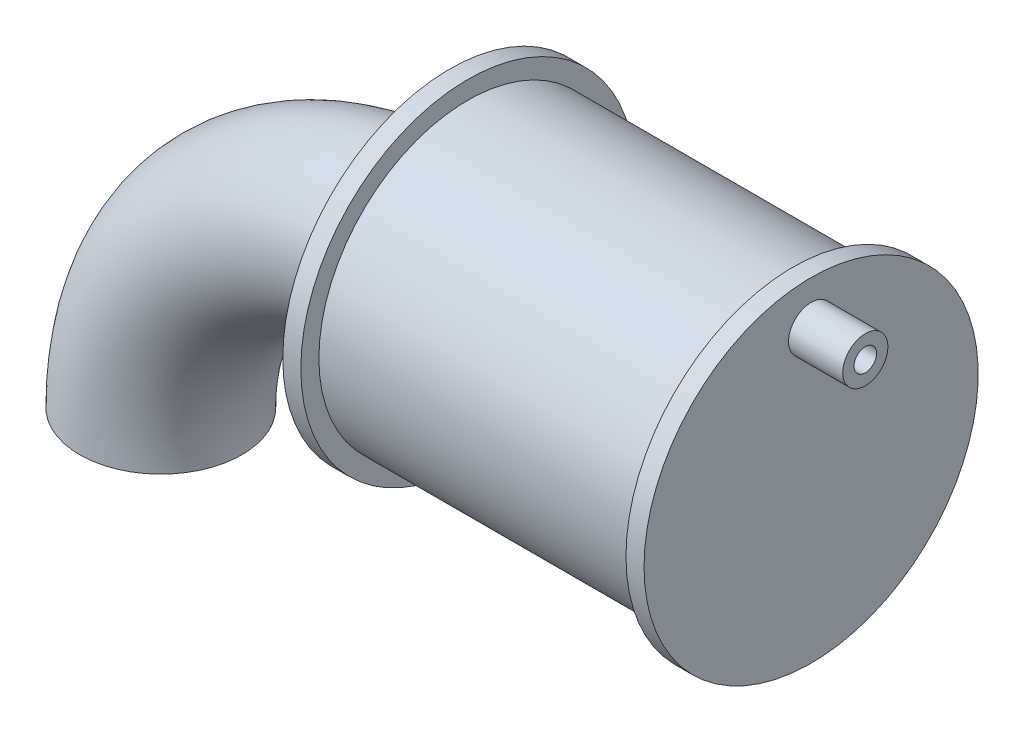
ISO-10303-21;
HEADER;
FILE_DESCRIPTION(('STEP AP214'),'2;1');
FILE_NAME('part.step','',(''),(''),'','','');
FILE_SCHEMA(('AUTOMOTIVE_DESIGN { 1 0 10303 214 1 1 1 1 }'));
ENDSEC;
DATA;
#1=APPLICATION_CONTEXT('core data for automotive mechanical design processes');
#2=APPLICATION_PROTOCOL_DEFINITION('international standard','automotive_design',2000,#1);
#3=PRODUCT_CONTEXT('',#1,'mechanical');
#4=PRODUCT('Part','Part','',(#3));
#5=PRODUCT_RELATED_PRODUCT_CATEGORY('part','',(#4));
#6=PRODUCT_DEFINITION_FORMATION('','',#4);
#7=PRODUCT_DEFINITION_CONTEXT('part definition',#1,'design');
#8=PRODUCT_DEFINITION('design','',#6,#7);
#9=PRODUCT_DEFINITION_SHAPE('','',#8);
#10=(LENGTH_UNIT() NAMED_UNIT(*) SI_UNIT(.MILLI.,.METRE.));
#11=(NAMED_UNIT(*) PLANE_ANGLE_UNIT() SI_UNIT($,.RADIAN.));
#12=(NAMED_UNIT(*) SI_UNIT($,.STERADIAN.) SOLID_ANGLE_UNIT());
#13=UNCERTAINTY_MEASURE_WITH_UNIT(LENGTH_MEASURE(1.E-05),#10,'distance_accuracy_value','');
#14=(GEOMETRIC_REPRESENTATION_CONTEXT(3) GLOBAL_UNCERTAINTY_ASSIGNED_CONTEXT((#13)) GLOBAL_UNIT_ASSIGNED_CONTEXT((#10,
#11,#12)) REPRESENTATION_CONTEXT('',''));
#15=CARTESIAN_POINT('',(0.,0.,0.));
#16=DIRECTION('',(0.,0.,1.));
#17=DIRECTION('',(1.,0.,0.));
#18=AXIS2_PLACEMENT_3D('',#15,#16,#17);
#19=CARTESIAN_POINT('',(38.,15.5,0.));
#20=DIRECTION('',(1.,0.,0.));
#21=DIRECTION('',(0.,0.,-1.));
#22=AXIS2_PLACEMENT_3D('',#19,#20,#21);
#23=PLANE('',#22);
#24=CARTESIAN_POINT('',(38.,13.611815839676,0.));
#25=DIRECTION('',(1.,0.,0.));
#26=DIRECTION('',(0.,0.,-1.));
#27=AXIS2_PLACEMENT_3D('',#24,#25,#26);
#28=CIRCLE('',#27,1.25);
#29=CARTESIAN_POINT('',(38.,13.611815839676,-1.25));
#30=VERTEX_POINT('',#29);
#31=EDGE_CURVE('E36',#30,#30,#28,.T.);
#32=ORIENTED_EDGE('',*,*,#31,.T.);
#33=EDGE_LOOP('',(#32));
#34=FACE_BOUND('',#33,.T.);
#35=CARTESIAN_POINT('',(38.,0.,0.));
#36=DIRECTION('',(-1.,0.,0.));
#37=DIRECTION('',(0.,0.,1.));
#38=AXIS2_PLACEMENT_3D('',#35,#36,#37);
#39=CIRCLE('',#38,15.5);
#40=CARTESIAN_POINT('',(38.,0.,15.5));
#41=VERTEX_POINT('',#40);
#42=EDGE_CURVE('E61',#41,#41,#39,.T.);
#43=ORIENTED_EDGE('',*,*,#42,.T.);
#44=EDGE_LOOP('',(#43));
#45=FACE_BOUND('',#44,.T.);
#46=ADVANCED_FACE('F32',(#34,#45),#23,.F.);
#47=CARTESIAN_POINT('',(-25.0815446339017,0.,0.));
#48=DIRECTION('',(-1.,0.,0.));
#49=DIRECTION('',(0.,0.,1.));
#50=AXIS2_PLACEMENT_3D('',#47,#48,#49);
#51=CYLINDRICAL_SURFACE('',#50,15.5);
#52=ORIENTED_EDGE('',*,*,#42,.F.);
#53=EDGE_LOOP('',(#52));
#54=FACE_BOUND('',#53,.T.);
#55=CARTESIAN_POINT('',(2.,0.,0.));
#56=DIRECTION('',(-1.,0.,0.));
#57=DIRECTION('',(0.,0.,1.));
#58=AXIS2_PLACEMENT_3D('',#55,#56,#57);
#59=CIRCLE('',#58,15.5);
#60=CARTESIAN_POINT('',(2.,0.,15.5));
#61=VERTEX_POINT('',#60);
#62=EDGE_CURVE('E64',#61,#61,#59,.T.);
#63=ORIENTED_EDGE('',*,*,#62,.T.);
#64=EDGE_LOOP('',(#63));
#65=FACE_BOUND('',#64,.T.);
#66=ADVANCED_FACE('F97',(#54,#65),#51,.F.);
#67=CARTESIAN_POINT('',(2.,15.5,0.));
#68=DIRECTION('',(-1.,0.,0.));
#69=DIRECTION('',(0.,0.,1.));
#70=AXIS2_PLACEMENT_3D('',#67,#68,#69);
#71=PLANE('',#70);
#72=ORIENTED_EDGE('',*,*,#62,.F.);
#73=EDGE_LOOP('',(#72));
#74=FACE_BOUND('',#73,.T.);
#75=CARTESIAN_POINT('',(2.,0.,0.));
#76=DIRECTION('',(1.,0.,0.));
#77=DIRECTION('',(0.,0.,-1.));
#78=AXIS2_PLACEMENT_3D('',#75,#76,#77);
#79=CIRCLE('',#78,7.);
#80=CARTESIAN_POINT('',(2.,0.,-7.));
#81=VERTEX_POINT('',#80);
#82=EDGE_CURVE('E88',#81,#81,#79,.T.);
#83=ORIENTED_EDGE('',*,*,#82,.F.);
#84=EDGE_LOOP('',(#83));
#85=FACE_BOUND('',#84,.T.);
#86=ADVANCED_FACE('F94',(#74,#85),#71,.F.);
#87=CARTESIAN_POINT('',(31.7,13.611815839676,0.));
#88=DIRECTION('',(1.,0.,0.));
#89=DIRECTION('',(0.,0.,-1.));
#90=AXIS2_PLACEMENT_3D('',#87,#88,#89);
#91=CYLINDRICAL_SURFACE('',#90,1.25);
#92=CARTESIAN_POINT('',(46.,13.611815839676,0.));
#93=DIRECTION('',(1.,0.,0.));
#94=DIRECTION('',(0.,0.,-1.));
#95=AXIS2_PLACEMENT_3D('',#92,#93,#94);
#96=CIRCLE('',#95,1.25);
#97=CARTESIAN_POINT('',(46.,13.611815839676,-1.25));
#98=VERTEX_POINT('',#97);
#99=EDGE_CURVE('E70',#98,#98,#96,.T.);
#100=CARTESIAN_POINT('',(46.,13.611815839676,-1.25));
#101=CARTESIAN_POINT('',(45.9166666666667,13.611815839676,-1.25));
#102=CARTESIAN_POINT('',(45.8333333333333,13.611815839676,-1.25));
#103=CARTESIAN_POINT('',(45.6666666666667,13.611815839676,-1.25));
#104=CARTESIAN_POINT('',(45.5833333333333,13.611815839676,-1.25));
#105=CARTESIAN_POINT('',(45.4166666666667,13.611815839676,-1.25));
#106=CARTESIAN_POINT('',(45.3333333333333,13.611815839676,-1.25));
#107=CARTESIAN_POINT('',(45.1666666666667,13.611815839676,-1.25));
#108=CARTESIAN_POINT('',(45.0833333333333,13.611815839676,-1.25));
#109=CARTESIAN_POINT('',(44.9166666666667,13.611815839676,-1.25));
#110=CARTESIAN_POINT('',(44.8333333333333,13.611815839676,-1.25));
#111=CARTESIAN_POINT('',(44.6666666666667,13.611815839676,-1.25));
#112=CARTESIAN_POINT('',(44.5833333333333,13.611815839676,-1.25));
#113=CARTESIAN_POINT('',(44.4166666666667,13.611815839676,-1.25));
#114=CARTESIAN_POINT('',(44.3333333333333,13.611815839676,-1.25));
#115=CARTESIAN_POINT('',(44.1666666666667,13.611815839676,-1.25));
#116=CARTESIAN_POINT('',(44.0833333333333,13.611815839676,-1.25));
#117=CARTESIAN_POINT('',(43.9166666666667,13.611815839676,-1.25));
#118=CARTESIAN_POINT('',(43.8333333333333,13.611815839676,-1.25));
#119=CARTESIAN_POINT('',(43.6666666666667,13.611815839676,-1.25));
#120=CARTESIAN_POINT('',(43.5833333333333,13.611815839676,-1.25));
#121=CARTESIAN_POINT('',(43.4166666666667,13.611815839676,-1.25));
#122=CARTESIAN_POINT('',(43.3333333333333,13.611815839676,-1.25));
#123=CARTESIAN_POINT('',(43.1666666666667,13.611815839676,-1.25));
#124=CARTESIAN_POINT('',(43.0833333333333,13.611815839676,-1.25));
#125=CARTESIAN_POINT('',(42.9166666666667,13.611815839676,-1.25));
#126=CARTESIAN_POINT('',(42.8333333333333,13.611815839676,-1.25));
#127=CARTESIAN_POINT('',(42.6666666666667,13.611815839676,-1.25));
#128=CARTESIAN_POINT('',(42.5833333333333,13.611815839676,-1.25));
#129=CARTESIAN_POINT('',(42.4166666666667,13.611815839676,-1.25));
#130=CARTESIAN_POINT('',(42.3333333333333,13.611815839676,-1.25));
#131=CARTESIAN_POINT('',(42.1666666666667,13.611815839676,-1.25));
#132=CARTESIAN_POINT('',(42.0833333333333,13.611815839676,-1.25));
#133=CARTESIAN_POINT('',(41.9166666666667,13.611815839676,-1.25));
#134=CARTESIAN_POINT('',(41.8333333333333,13.611815839676,-1.25));
#135=CARTESIAN_POINT('',(41.6666666666667,13.611815839676,-1.25));
#136=CARTESIAN_POINT('',(41.5833333333333,13.611815839676,-1.25));
#137=CARTESIAN_POINT('',(41.4166666666667,13.611815839676,-1.25));
#138=CARTESIAN_POINT('',(41.3333333333333,13.611815839676,-1.25));
#139=CARTESIAN_POINT('',(41.1666666666667,13.611815839676,-1.25));
#140=CARTESIAN_POINT('',(41.0833333333333,13.611815839676,-1.25));
#141=CARTESIAN_POINT('',(40.9166666666667,13.611815839676,-1.25));
#142=CARTESIAN_POINT('',(40.8333333333333,13.611815839676,-1.25));
#143=CARTESIAN_POINT('',(40.6666666666667,13.611815839676,-1.25));
#144=CARTESIAN_POINT('',(40.5833333333333,13.611815839676,-1.25));
#145=CARTESIAN_POINT('',(40.4166666666667,13.611815839676,-1.25));
#146=CARTESIAN_POINT('',(40.3333333333333,13.611815839676,-1.25));
#147=CARTESIAN_POINT('',(40.1666666666667,13.611815839676,-1.25));
#148=CARTESIAN_POINT('',(40.0833333333333,13.611815839676,-1.25));
#149=CARTESIAN_POINT('',(39.9166666666667,13.611815839676,-1.25));
#150=CARTESIAN_POINT('',(39.8333333333333,13.611815839676,-1.25));
#151=CARTESIAN_POINT('',(39.6666666666667,13.611815839676,-1.25));
#152=CARTESIAN_POINT('',(39.5833333333333,13.611815839676,-1.25));
#153=CARTESIAN_POINT('',(39.4166666666667,13.611815839676,-1.25));
#154=CARTESIAN_POINT('',(39.3333333333333,13.611815839676,-1.25));
#155=CARTESIAN_POINT('',(39.1666666666667,13.611815839676,-1.25));
#156=CARTESIAN_POINT('',(39.0833333333333,13.611815839676,-1.25));
#157=CARTESIAN_POINT('',(38.9166666666667,13.611815839676,-1.25));
#158=CARTESIAN_POINT('',(38.8333333333333,13.611815839676,-1.25));
#159=CARTESIAN_POINT('',(38.6666666666667,13.611815839676,-1.25));
#160=CARTESIAN_POINT('',(38.5833333333333,13.611815839676,-1.25));
#161=CARTESIAN_POINT('',(38.4166666666667,13.611815839676,-1.25));
#162=CARTESIAN_POINT('',(38.3333333333333,13.611815839676,-1.25));
#163=CARTESIAN_POINT('',(38.1666666666667,13.611815839676,-1.25));
#164=CARTESIAN_POINT('',(38.0833333333333,13.611815839676,-1.25));
#165=CARTESIAN_POINT('',(38.,13.611815839676,-1.25));
#166=B_SPLINE_CURVE_WITH_KNOTS('',3,(#100,#101,#102,#103,#104,#105,#106,#107,#108,#109,#110,
#111,#112,#113,#114,#115,#116,#117,#118,#119,#120,#121,#122,#123,#124,#125,#126,#127,#128,#129,
#130,#131,#132,#133,#134,#135,#136,#137,#138,#139,#140,#141,#142,#143,#144,#145,#146,#147,#148,
#149,#150,#151,#152,#153,#154,#155,#156,#157,#158,#159,#160,#161,#162,#163,#164,#165),
.UNSPECIFIED.,.F.,.F.,(4,2,2,2,2,2,2,2,2,2,2,2,2,2,2,2,2,2,2,2,2,2,2,2,2,2,2,2,2,2,2,2,4),(0.,
0.25,0.5,0.750000000000001,1.,1.25,1.5,1.75,2.,2.25,2.5,2.75,3.,3.25,3.5,3.75,4.,4.25,4.5,4.75,
5.,5.25,5.5,5.75,5.99999999999999,6.24999999999999,6.49999999999999,6.74999999999999,
6.99999999999999,7.24999999999999,7.49999999999999,7.74999999999999,7.99999999999999),.UNSPECIFIED.);
#167=EDGE_CURVE('BSEAM96',#98,#30,#166,.T.);
#168=ORIENTED_EDGE('',*,*,#99,.T.);
#169=ORIENTED_EDGE('',*,*,#31,.F.);
#170=ORIENTED_EDGE('',*,*,#167,.T.);
#171=ORIENTED_EDGE('',*,*,#167,.F.);
#172=EDGE_LOOP('',(#168,#170,#169,#171));
#173=FACE_BOUND('',#172,.T.);
#174=ADVANCED_FACE('F96',(#173),#91,.F.);
#175=CARTESIAN_POINT('',(40.,0.,0.));
#176=DIRECTION('',(-1.,0.,0.));
#177=DIRECTION('',(0.,0.,1.));
#178=AXIS2_PLACEMENT_3D('',#175,#176,#177);
#179=PLANE('',#178);
#180=CARTESIAN_POINT('',(40.,0.,0.));
#181=DIRECTION('',(-1.,0.,0.));
#182=DIRECTION('',(0.,0.,1.));
#183=AXIS2_PLACEMENT_3D('',#180,#181,#182);
#184=CIRCLE('',#183,18.5);
#185=CARTESIAN_POINT('',(40.,0.,18.5));
#186=VERTEX_POINT('',#185);
#187=EDGE_CURVE('E58',#186,#186,#184,.T.);
#188=ORIENTED_EDGE('',*,*,#187,.F.);
#189=EDGE_LOOP('',(#188));
#190=FACE_BOUND('',#189,.T.);
#191=CARTESIAN_POINT('',(40.,13.611815839676,0.));
#192=DIRECTION('',(-1.,0.,0.));
#193=DIRECTION('',(0.,0.,1.));
#194=AXIS2_PLACEMENT_3D('',#191,#192,#193);
#195=CIRCLE('',#194,2.5);
#196=CARTESIAN_POINT('',(40.,13.611815839676,2.5));
#197=VERTEX_POINT('',#196);
#198=EDGE_CURVE('E10',#197,#197,#195,.F.);
#199=ORIENTED_EDGE('',*,*,#198,.F.);
#200=EDGE_LOOP('',(#199));
#201=FACE_BOUND('',#200,.T.);
#202=ADVANCED_FACE('F104',(#190,#201),#179,.F.);
#203=CARTESIAN_POINT('',(0.,0.,0.));
#204=DIRECTION('',(1.,0.,0.));
#205=DIRECTION('',(0.,0.,-1.));
#206=AXIS2_PLACEMENT_3D('',#203,#204,#205);
#207=PLANE('',#206);
#208=CARTESIAN_POINT('',(0.,0.,0.));
#209=DIRECTION('',(-1.,0.,0.));
#210=DIRECTION('',(0.,0.,1.));
#211=AXIS2_PLACEMENT_3D('',#208,#209,#210);
#212=CIRCLE('',#211,9.);
#213=CARTESIAN_POINT('',(0.,0.,9.));
#214=VERTEX_POINT('',#213);
#215=EDGE_CURVE('E73',#214,#214,#212,.T.);
#216=ORIENTED_EDGE('',*,*,#215,.F.);
#217=EDGE_LOOP('',(#216));
#218=FACE_BOUND('',#217,.T.);
#219=CARTESIAN_POINT('',(0.,0.,0.));
#220=DIRECTION('',(-1.,0.,0.));
#221=DIRECTION('',(0.,0.,1.));
#222=AXIS2_PLACEMENT_3D('',#219,#220,#221);
#223=CIRCLE('',#222,18.5);
#224=CARTESIAN_POINT('',(0.,0.,18.5));
#225=VERTEX_POINT('',#224);
#226=EDGE_CURVE('E40',#225,#225,#223,.T.);
#227=ORIENTED_EDGE('',*,*,#226,.T.);
#228=EDGE_LOOP('',(#227));
#229=FACE_BOUND('',#228,.T.);
#230=ADVANCED_FACE('F34',(#218,#229),#207,.F.);
#231=CARTESIAN_POINT('',(-25.0815446339017,0.,0.));
#232=DIRECTION('',(-1.,0.,0.));
#233=DIRECTION('',(0.,0.,1.));
#234=AXIS2_PLACEMENT_3D('',#231,#232,#233);
#235=CYLINDRICAL_SURFACE('',#234,18.5);
#236=ORIENTED_EDGE('',*,*,#226,.F.);
#237=EDGE_LOOP('',(#236));
#238=FACE_BOUND('',#237,.T.);
#239=CARTESIAN_POINT('',(2.00000000000001,0.,0.));
#240=DIRECTION('',(-1.,0.,0.));
#241=DIRECTION('',(0.,0.,1.));
#242=AXIS2_PLACEMENT_3D('',#239,#240,#241);
#243=CIRCLE('',#242,18.5);
#244=CARTESIAN_POINT('',(2.00000000000001,0.,18.5));
#245=VERTEX_POINT('',#244);
#246=EDGE_CURVE('E44',#245,#245,#243,.T.);
#247=ORIENTED_EDGE('',*,*,#246,.T.);
#248=EDGE_LOOP('',(#247));
#249=FACE_BOUND('',#248,.T.);
#250=ADVANCED_FACE('F137',(#238,#249),#235,.T.);
#251=CARTESIAN_POINT('',(2.00000000000001,16.5,0.));
#252=DIRECTION('',(-1.,0.,0.));
#253=DIRECTION('',(0.,0.,1.));
#254=AXIS2_PLACEMENT_3D('',#251,#252,#253);
#255=PLANE('',#254);
#256=ORIENTED_EDGE('',*,*,#246,.F.);
#257=EDGE_LOOP('',(#256));
#258=FACE_BOUND('',#257,.T.);
#259=CARTESIAN_POINT('',(2.00000000000001,0.,0.));
#260=DIRECTION('',(-1.,0.,0.));
#261=DIRECTION('',(0.,0.,1.));
#262=AXIS2_PLACEMENT_3D('',#259,#260,#261);
#263=CIRCLE('',#262,16.5);
#264=CARTESIAN_POINT('',(2.00000000000001,0.,16.5));
#265=VERTEX_POINT('',#264);
#266=EDGE_CURVE('E49',#265,#265,#263,.T.);
#267=ORIENTED_EDGE('',*,*,#266,.T.);
#268=EDGE_LOOP('',(#267));
#269=FACE_BOUND('',#268,.T.);
#270=ADVANCED_FACE('F134',(#258,#269),#255,.F.);
#271=CARTESIAN_POINT('',(-25.0815446339017,0.,0.));
#272=DIRECTION('',(-1.,0.,0.));
#273=DIRECTION('',(0.,0.,1.));
#274=AXIS2_PLACEMENT_3D('',#271,#272,#273);
#275=CYLINDRICAL_SURFACE('',#274,16.5);
#276=ORIENTED_EDGE('',*,*,#266,.F.);
#277=EDGE_LOOP('',(#276));
#278=FACE_BOUND('',#277,.T.);
#279=CARTESIAN_POINT('',(38.,0.,0.));
#280=DIRECTION('',(-1.,0.,0.));
#281=DIRECTION('',(0.,0.,1.));
#282=AXIS2_PLACEMENT_3D('',#279,#280,#281);
#283=CIRCLE('',#282,16.5);
#284=CARTESIAN_POINT('',(38.,0.,16.5));
#285=VERTEX_POINT('',#284);
#286=EDGE_CURVE('E52',#285,#285,#283,.T.);
#287=ORIENTED_EDGE('',*,*,#286,.T.);
#288=EDGE_LOOP('',(#287));
#289=FACE_BOUND('',#288,.T.);
#290=ADVANCED_FACE('F130',(#278,#289),#275,.T.);
#291=CARTESIAN_POINT('',(38.,16.5,0.));
#292=DIRECTION('',(1.,0.,0.));
#293=DIRECTION('',(0.,0.,-1.));
#294=AXIS2_PLACEMENT_3D('',#291,#292,#293);
#295=PLANE('',#294);
#296=ORIENTED_EDGE('',*,*,#286,.F.);
#297=EDGE_LOOP('',(#296));
#298=FACE_BOUND('',#297,.T.);
#299=CARTESIAN_POINT('',(38.,0.,0.));
#300=DIRECTION('',(-1.,0.,0.));
#301=DIRECTION('',(0.,0.,1.));
#302=AXIS2_PLACEMENT_3D('',#299,#300,#301);
#303=CIRCLE('',#302,18.5);
#304=CARTESIAN_POINT('',(38.,0.,18.5));
#305=VERTEX_POINT('',#304);
#306=EDGE_CURVE('E55',#305,#305,#303,.T.);
#307=ORIENTED_EDGE('',*,*,#306,.T.);
#308=EDGE_LOOP('',(#307));
#309=FACE_BOUND('',#308,.T.);
#310=ADVANCED_FACE('F126',(#298,#309),#295,.F.);
#311=CARTESIAN_POINT('',(-25.0815446339017,0.,0.));
#312=DIRECTION('',(-1.,0.,0.));
#313=DIRECTION('',(0.,0.,1.));
#314=AXIS2_PLACEMENT_3D('',#311,#312,#313);
#315=CYLINDRICAL_SURFACE('',#314,18.5);
#316=ORIENTED_EDGE('',*,*,#306,.F.);
#317=EDGE_LOOP('',(#316));
#318=FACE_BOUND('',#317,.T.);
#319=ORIENTED_EDGE('',*,*,#187,.T.);
#320=EDGE_LOOP('',(#319));
#321=FACE_BOUND('',#320,.T.);
#322=ADVANCED_FACE('F122',(#318,#321),#315,.T.);
#323=CARTESIAN_POINT('',(46.,13.611815839676,0.));
#324=DIRECTION('',(-1.,0.,0.));
#325=DIRECTION('',(0.,0.,1.));
#326=AXIS2_PLACEMENT_3D('',#323,#324,#325);
#327=CYLINDRICAL_SURFACE('',#326,2.5);
#328=CARTESIAN_POINT('',(46.,13.611815839676,0.));
#329=DIRECTION('',(1.,0.,0.));
#330=DIRECTION('',(0.,0.,-1.));
#331=AXIS2_PLACEMENT_3D('',#328,#329,#330);
#332=CIRCLE('',#331,2.5);
#333=CARTESIAN_POINT('',(46.,13.611815839676,-2.5));
#334=VERTEX_POINT('',#333);
#335=EDGE_CURVE('E67',#334,#334,#332,.T.);
#336=ORIENTED_EDGE('',*,*,#335,.F.);
#337=EDGE_LOOP('',(#336));
#338=FACE_BOUND('',#337,.T.);
#339=ORIENTED_EDGE('',*,*,#198,.T.);
#340=EDGE_LOOP('',(#339));
#341=FACE_BOUND('',#340,.T.);
#342=ADVANCED_FACE('F125',(#338,#341),#327,.T.);
#343=CARTESIAN_POINT('',(46.,13.611815839676,0.));
#344=DIRECTION('',(1.,0.,0.));
#345=DIRECTION('',(0.,0.,-1.));
#346=AXIS2_PLACEMENT_3D('',#343,#344,#345);
#347=PLANE('',#346);
#348=ORIENTED_EDGE('',*,*,#99,.F.);
#349=EDGE_LOOP('',(#348));
#350=FACE_BOUND('',#349,.T.);
#351=ORIENTED_EDGE('',*,*,#335,.T.);
#352=EDGE_LOOP('',(#351));
#353=FACE_BOUND('',#352,.T.);
#354=ADVANCED_FACE('F165',(#350,#353),#347,.T.);
#355=CARTESIAN_POINT('',(-2.,0.,0.));
#356=DIRECTION('',(1.,0.,0.));
#357=DIRECTION('',(0.,0.,-1.));
#358=AXIS2_PLACEMENT_3D('',#355,#356,#357);
#359=CYLINDRICAL_SURFACE('',#358,9.);
#360=CARTESIAN_POINT('',(-2.,0.,0.));
#361=DIRECTION('',(1.,0.,0.));
#362=DIRECTION('',(0.,0.,-1.));
#363=AXIS2_PLACEMENT_3D('',#360,#361,#362);
#364=CIRCLE('',#363,9.);
#365=CARTESIAN_POINT('',(-2.,9.,0.));
#366=VERTEX_POINT('',#365);
#367=EDGE_CURVE('E82',#366,#366,#364,.T.);
#368=ORIENTED_EDGE('',*,*,#367,.T.);
#369=EDGE_LOOP('',(#368));
#370=FACE_BOUND('',#369,.T.);
#371=ORIENTED_EDGE('',*,*,#215,.T.);
#372=EDGE_LOOP('',(#371));
#373=FACE_BOUND('',#372,.T.);
#374=ADVANCED_FACE('F162',(#370,#373),#359,.T.);
#375=CARTESIAN_POINT('',(-2.,-30.,0.));
#376=DIRECTION('',(0.,0.,1.));
#377=DIRECTION('',(1.,0.,0.));
#378=AXIS2_PLACEMENT_3D('',#375,#376,#377);
#379=TOROIDAL_SURFACE('',#378,30.,9.);
#380=CARTESIAN_POINT('',(-32.,-30.,0.));
#381=DIRECTION('',(0.,1.,0.));
#382=DIRECTION('',(0.,0.,-1.));
#383=AXIS2_PLACEMENT_3D('',#380,#381,#382);
#384=CIRCLE('',#383,9.);
#385=CARTESIAN_POINT('',(-41.,-30.,0.));
#386=VERTEX_POINT('',#385);
#387=EDGE_CURVE('E76',#386,#386,#384,.T.);
#388=CARTESIAN_POINT('',(-2.,-30.,0.));
#389=DIRECTION('',(0.,0.,1.));
#390=DIRECTION('',(1.,0.,0.));
#391=AXIS2_PLACEMENT_3D('',#388,#389,#390);
#392=CIRCLE('',#391,39.);
#393=EDGE_CURVE('',#366,#386,#392,.T.);
#394=ORIENTED_EDGE('',*,*,#367,.F.);
#395=ORIENTED_EDGE('',*,*,#387,.T.);
#396=ORIENTED_EDGE('',*,*,#393,.T.);
#397=ORIENTED_EDGE('',*,*,#393,.F.);
#398=EDGE_LOOP('',(#394,#396,#395,#397));
#399=FACE_BOUND('',#398,.T.);
#400=ADVANCED_FACE('F164',(#399),#379,.T.);
#401=CARTESIAN_POINT('',(-2.,-30.,0.));
#402=DIRECTION('',(0.,0.,1.));
#403=DIRECTION('',(1.,0.,0.));
#404=AXIS2_PLACEMENT_3D('',#401,#402,#403);
#405=TOROIDAL_SURFACE('',#404,30.,7.);
#406=CARTESIAN_POINT('',(-2.,0.,0.));
#407=DIRECTION('',(1.,0.,0.));
#408=DIRECTION('',(0.,0.,-1.));
#409=AXIS2_PLACEMENT_3D('',#406,#407,#408);
#410=CIRCLE('',#409,7.);
#411=CARTESIAN_POINT('',(-2.,7.,0.));
#412=VERTEX_POINT('',#411);
#413=EDGE_CURVE('E85',#412,#412,#410,.T.);
#414=CARTESIAN_POINT('',(-32.,-30.,0.));
#415=DIRECTION('',(0.,1.,0.));
#416=DIRECTION('',(0.,0.,-1.));
#417=AXIS2_PLACEMENT_3D('',#414,#415,#416);
#418=CIRCLE('',#417,7.);
#419=CARTESIAN_POINT('',(-39.,-30.,0.));
#420=VERTEX_POINT('',#419);
#421=EDGE_CURVE('E79',#420,#420,#418,.T.);
#422=CARTESIAN_POINT('',(-2.,-30.,0.));
#423=DIRECTION('',(0.,0.,1.));
#424=DIRECTION('',(1.,0.,0.));
#425=AXIS2_PLACEMENT_3D('',#422,#423,#424);
#426=CIRCLE('',#425,37.);
#427=EDGE_CURVE('',#412,#420,#426,.T.);
#428=ORIENTED_EDGE('',*,*,#413,.T.);
#429=ORIENTED_EDGE('',*,*,#421,.F.);
#430=ORIENTED_EDGE('',*,*,#427,.T.);
#431=ORIENTED_EDGE('',*,*,#427,.F.);
#432=EDGE_LOOP('',(#428,#430,#429,#431));
#433=FACE_BOUND('',#432,.T.);
#434=ADVANCED_FACE('F172',(#433),#405,.F.);
#435=CARTESIAN_POINT('',(-2.,0.,0.));
#436=DIRECTION('',(1.,0.,0.));
#437=DIRECTION('',(0.,0.,-1.));
#438=AXIS2_PLACEMENT_3D('',#435,#436,#437);
#439=CYLINDRICAL_SURFACE('',#438,7.);
#440=ORIENTED_EDGE('',*,*,#413,.F.);
#441=EDGE_LOOP('',(#440));
#442=FACE_BOUND('',#441,.T.);
#443=ORIENTED_EDGE('',*,*,#82,.T.);
#444=EDGE_LOOP('',(#443));
#445=FACE_BOUND('',#444,.T.);
#446=ADVANCED_FACE('F92',(#442,#445),#439,.F.);
#447=CARTESIAN_POINT('',(-32.,-30.,0.));
#448=DIRECTION('',(0.,1.,0.));
#449=DIRECTION('',(0.,0.,-1.));
#450=AXIS2_PLACEMENT_3D('',#447,#448,#449);
#451=PLANE('',#450);
#452=ORIENTED_EDGE('',*,*,#421,.T.);
#453=EDGE_LOOP('',(#452));
#454=FACE_BOUND('',#453,.T.);
#455=ORIENTED_EDGE('',*,*,#387,.F.);
#456=EDGE_LOOP('',(#455));
#457=FACE_BOUND('',#456,.T.);
#458=ADVANCED_FACE('F179',(#454,#457),#451,.F.);
#459=CLOSED_SHELL('',(#46,#66,#86,#174,#202,#230,#250,#270,#290,#310,#322,#342,#354,#374,#400,
#434,#446,#458));
#460=MANIFOLD_SOLID_BREP('B2',#459);
#461=ADVANCED_BREP_SHAPE_REPRESENTATION('',(#18,#460),#14);
#462=SHAPE_DEFINITION_REPRESENTATION(#9,#461);
ENDSEC;
END-ISO-10303-21;
